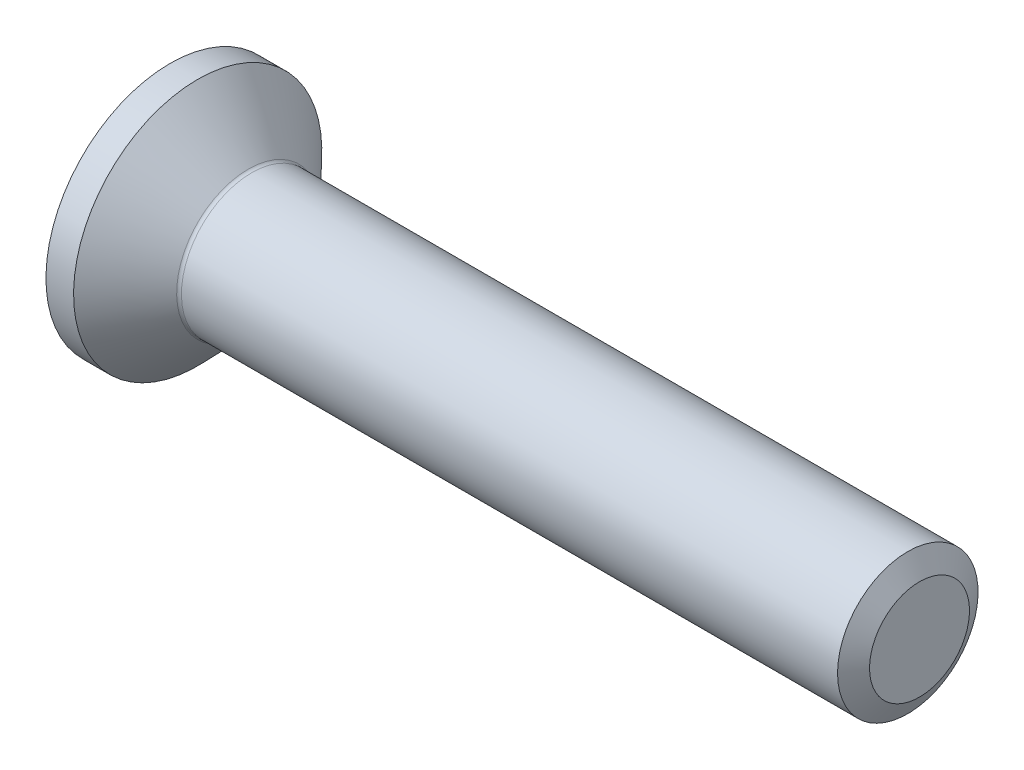
ISO-10303-21;
HEADER;
FILE_DESCRIPTION(('STEP AP214'),'2;1');
FILE_NAME('part.step','',(''),(''),'','','');
FILE_SCHEMA(('AUTOMOTIVE_DESIGN { 1 0 10303 214 1 1 1 1 }'));
ENDSEC;
DATA;
#1=APPLICATION_CONTEXT('core data for automotive mechanical design processes');
#2=APPLICATION_PROTOCOL_DEFINITION('international standard','automotive_design',2000,#1);
#3=PRODUCT_CONTEXT('',#1,'mechanical');
#4=PRODUCT('Part','Part','',(#3));
#5=PRODUCT_RELATED_PRODUCT_CATEGORY('part','',(#4));
#6=PRODUCT_DEFINITION_FORMATION('','',#4);
#7=PRODUCT_DEFINITION_CONTEXT('part definition',#1,'design');
#8=PRODUCT_DEFINITION('design','',#6,#7);
#9=PRODUCT_DEFINITION_SHAPE('','',#8);
#10=(LENGTH_UNIT() NAMED_UNIT(*) SI_UNIT(.MILLI.,.METRE.));
#11=(NAMED_UNIT(*) PLANE_ANGLE_UNIT() SI_UNIT($,.RADIAN.));
#12=(NAMED_UNIT(*) SI_UNIT($,.STERADIAN.) SOLID_ANGLE_UNIT());
#13=UNCERTAINTY_MEASURE_WITH_UNIT(LENGTH_MEASURE(1.E-05),#10,'distance_accuracy_value','');
#14=(GEOMETRIC_REPRESENTATION_CONTEXT(3) GLOBAL_UNCERTAINTY_ASSIGNED_CONTEXT((#13)) GLOBAL_UNIT_ASSIGNED_CONTEXT((#10,
#11,#12)) REPRESENTATION_CONTEXT('',''));
#15=CARTESIAN_POINT('',(0.,0.,0.));
#16=DIRECTION('',(0.,0.,1.));
#17=DIRECTION('',(1.,0.,0.));
#18=AXIS2_PLACEMENT_3D('',#15,#16,#17);
#19=CARTESIAN_POINT('',(0.,0.,0.));
#20=DIRECTION('',(1.,0.,0.));
#21=DIRECTION('',(0.,1.,0.));
#22=AXIS2_PLACEMENT_3D('',#19,#20,#21);
#23=CYLINDRICAL_SURFACE('',#22,1.5);
#24=CARTESIAN_POINT('',(-14.257552518379,0.,0.));
#25=DIRECTION('',(1.,0.,0.));
#26=DIRECTION('',(0.,1.,0.));
#27=AXIS2_PLACEMENT_3D('',#24,#25,#26);
#28=CIRCLE('',#27,1.5);
#29=CARTESIAN_POINT('',(-14.257552518379,1.5,0.));
#30=VERTEX_POINT('',#29);
#31=EDGE_CURVE('E143',#30,#30,#28,.T.);
#32=ORIENTED_EDGE('',*,*,#31,.T.);
#33=EDGE_LOOP('',(#32));
#34=FACE_BOUND('',#33,.T.);
#35=CARTESIAN_POINT('',(-0.25,0.,0.));
#36=DIRECTION('',(-1.,0.,0.));
#37=DIRECTION('',(0.,0.,1.));
#38=AXIS2_PLACEMENT_3D('',#35,#36,#37);
#39=CIRCLE('',#38,1.5);
#40=CARTESIAN_POINT('',(-0.25,0.,1.5));
#41=VERTEX_POINT('',#40);
#42=EDGE_CURVE('E333',#41,#41,#39,.T.);
#43=ORIENTED_EDGE('',*,*,#42,.T.);
#44=EDGE_LOOP('',(#43));
#45=FACE_BOUND('',#44,.T.);
#46=ADVANCED_FACE('F51',(#34,#45),#23,.T.);
#47=CARTESIAN_POINT('',(-16.,2.65,0.));
#48=DIRECTION('',(-1.,0.,0.));
#49=DIRECTION('',(0.,-1.,0.));
#50=AXIS2_PLACEMENT_3D('',#47,#48,#49);
#51=PLANE('',#50);
#52=CARTESIAN_POINT('',(-16.,0.,0.));
#53=DIRECTION('',(1.,0.,0.));
#54=DIRECTION('',(0.,1.,0.));
#55=AXIS2_PLACEMENT_3D('',#52,#53,#54);
#56=CIRCLE('',#55,2.65);
#57=CARTESIAN_POINT('',(-16.,2.65,0.));
#58=VERTEX_POINT('',#57);
#59=EDGE_CURVE('E238',#58,#58,#56,.T.);
#60=ORIENTED_EDGE('',*,*,#59,.F.);
#61=EDGE_LOOP('',(#60));
#62=FACE_BOUND('',#61,.T.);
#63=CARTESIAN_POINT('',(-16.,0.,0.));
#64=DIRECTION('',(-1.,0.,0.));
#65=DIRECTION('',(0.,-1.,0.));
#66=AXIS2_PLACEMENT_3D('',#63,#64,#65);
#67=CIRCLE('',#66,1.15470053837925);
#68=CARTESIAN_POINT('',(-16.,-0.577350269189631,0.999999999999996));
#69=VERTEX_POINT('',#68);
#70=CARTESIAN_POINT('',(-16.,-1.15470053837925,0.));
#71=VERTEX_POINT('',#70);
#72=EDGE_CURVE('E55',#69,#71,#67,.F.);
#73=ORIENTED_EDGE('',*,*,#72,.T.);
#74=CARTESIAN_POINT('',(-16.,-0.577350269189631,-0.999999999999997));
#75=VERTEX_POINT('',#74);
#76=EDGE_CURVE('E11',#71,#75,#67,.F.);
#77=ORIENTED_EDGE('',*,*,#76,.T.);
#78=CARTESIAN_POINT('',(-16.,0.577350269189626,-0.999999999999999));
#79=VERTEX_POINT('',#78);
#80=EDGE_CURVE('E61',#75,#79,#67,.F.);
#81=ORIENTED_EDGE('',*,*,#80,.T.);
#82=CARTESIAN_POINT('',(-16.,1.15470053837925,0.));
#83=VERTEX_POINT('',#82);
#84=EDGE_CURVE('E128',#79,#83,#67,.F.);
#85=ORIENTED_EDGE('',*,*,#84,.T.);
#86=CARTESIAN_POINT('',(-16.,0.,0.));
#87=DIRECTION('',(-1.,0.,0.));
#88=DIRECTION('',(0.,0.,1.));
#89=AXIS2_PLACEMENT_3D('',#86,#87,#88);
#90=CIRCLE('',#89,1.15470053837925);
#91=CARTESIAN_POINT('',(-16.,0.577350269189629,0.999999999999997));
#92=VERTEX_POINT('',#91);
#93=EDGE_CURVE('E111',#92,#83,#90,.T.);
#94=ORIENTED_EDGE('',*,*,#93,.F.);
#95=EDGE_CURVE('E121',#92,#69,#67,.F.);
#96=ORIENTED_EDGE('',*,*,#95,.T.);
#97=EDGE_LOOP('',(#73,#77,#81,#85,#94,#96));
#98=FACE_BOUND('',#97,.T.);
#99=ADVANCED_FACE('F129',(#62,#98),#51,.T.);
#100=CARTESIAN_POINT('',(0.,0.,0.));
#101=DIRECTION('',(1.,0.,0.));
#102=DIRECTION('',(0.,1.,0.));
#103=AXIS2_PLACEMENT_3D('',#100,#101,#102);
#104=CYLINDRICAL_SURFACE('',#103,2.65);
#105=ORIENTED_EDGE('',*,*,#59,.T.);
#106=EDGE_LOOP('',(#105));
#107=FACE_BOUND('',#106,.T.);
#108=CARTESIAN_POINT('',(-15.4105420910281,0.,0.));
#109=DIRECTION('',(1.,0.,0.));
#110=DIRECTION('',(0.,1.,0.));
#111=AXIS2_PLACEMENT_3D('',#108,#109,#110);
#112=CIRCLE('',#111,2.65);
#113=CARTESIAN_POINT('',(-15.4105420910281,2.65,0.));
#114=VERTEX_POINT('',#113);
#115=EDGE_CURVE('E241',#114,#114,#112,.T.);
#116=ORIENTED_EDGE('',*,*,#115,.F.);
#117=EDGE_LOOP('',(#116));
#118=FACE_BOUND('',#117,.T.);
#119=ADVANCED_FACE('F226',(#107,#118),#104,.T.);
#120=CARTESIAN_POINT('',(-14.3294864984129,0.,0.));
#121=DIRECTION('',(-1.,0.,0.));
#122=DIRECTION('',(0.,-1.,0.));
#123=AXIS2_PLACEMENT_3D('',#120,#121,#122);
#124=CONICAL_SURFACE('',#123,1.5305341629541,0.802851455917393);
#125=ORIENTED_EDGE('',*,*,#115,.T.);
#126=EDGE_LOOP('',(#125));
#127=FACE_BOUND('',#126,.T.);
#128=CARTESIAN_POINT('',(-14.3294864984129,0.,0.));
#129=DIRECTION('',(1.,0.,0.));
#130=DIRECTION('',(0.,1.,0.));
#131=AXIS2_PLACEMENT_3D('',#128,#129,#130);
#132=CIRCLE('',#131,1.5305341629541);
#133=CARTESIAN_POINT('',(-14.3294864984129,1.5305341629541,0.));
#134=VERTEX_POINT('',#133);
#135=EDGE_CURVE('E247',#134,#134,#132,.T.);
#136=ORIENTED_EDGE('',*,*,#135,.F.);
#137=EDGE_LOOP('',(#136));
#138=FACE_BOUND('',#137,.T.);
#139=ADVANCED_FACE('F222',(#127,#138),#124,.T.);
#140=CARTESIAN_POINT('',(-14.257552518379,0.,0.));
#141=DIRECTION('',(1.,0.,0.));
#142=DIRECTION('',(0.,1.,0.));
#143=AXIS2_PLACEMENT_3D('',#140,#141,#142);
#144=TOROIDAL_SURFACE('',#143,1.6,0.0999999999999996);
#145=ORIENTED_EDGE('',*,*,#135,.T.);
#146=EDGE_LOOP('',(#145));
#147=FACE_BOUND('',#146,.T.);
#148=ORIENTED_EDGE('',*,*,#31,.F.);
#149=EDGE_LOOP('',(#148));
#150=FACE_BOUND('',#149,.T.);
#151=ADVANCED_FACE('F218',(#147,#150),#144,.F.);
#152=CARTESIAN_POINT('',(-15.7,0.,0.));
#153=DIRECTION('',(-1.,0.,0.));
#154=DIRECTION('',(0.,0.,1.));
#155=AXIS2_PLACEMENT_3D('',#152,#153,#154);
#156=CONICAL_SURFACE('',#155,0.,1.31660847419538);
#157=CARTESIAN_POINT('',(-16.0000300044996,-0.57723479913579,1.0002));
#158=CARTESIAN_POINT('',(-15.9937929192042,-0.601225021738601,0.958647715567044));
#159=CARTESIAN_POINT('',(-15.9881313786167,-0.625256195021442,0.917024502475671));
#160=CARTESIAN_POINT('',(-15.9781854217223,-0.673398386330441,0.833639781140784));
#161=CARTESIAN_POINT('',(-15.9739015302713,-0.697509431260085,0.791878226299064));
#162=CARTESIAN_POINT('',(-15.9669589031667,-0.745673772514857,0.708455140132715));
#163=CARTESIAN_POINT('',(-15.9642923745456,-0.769726780462718,0.66679410829216));
#164=CARTESIAN_POINT('',(-15.9607168929941,-0.81786166422335,0.583422044002323));
#165=CARTESIAN_POINT('',(-15.9598076211353,-0.841943534003895,0.541711022001162));
#166=CARTESIAN_POINT('',(-15.9598076211353,-0.890107273564985,0.458288977998839));
#167=CARTESIAN_POINT('',(-15.9607168929941,-0.91418914334553,0.416577955997678));
#168=CARTESIAN_POINT('',(-15.9642923745456,-0.962324027106162,0.333205891707841));
#169=CARTESIAN_POINT('',(-15.9669589031667,-0.986377035054024,0.291544859867286));
#170=CARTESIAN_POINT('',(-15.9739015302713,-1.03454137630879,0.208121773700937));
#171=CARTESIAN_POINT('',(-15.9781854217223,-1.05865242123844,0.166360218859216));
#172=CARTESIAN_POINT('',(-15.9881313786167,-1.10679461254744,0.0829754975243295));
#173=CARTESIAN_POINT('',(-15.9937929192042,-1.13082578583028,0.0413522844329568));
#174=CARTESIAN_POINT('',(-16.0000300044996,-1.15481600843309,-0.000199999999999005));
#175=B_SPLINE_CURVE_WITH_KNOTS('',3,(#157,#158,#159,#160,#161,#162,#163,#164,#165,#166,#167,
#168,#169,#170,#171,#172,#173,#174),.UNSPECIFIED.,.F.,.F.,(4,2,2,2,2,2,2,2,4),(0.,
0.145159524820138,0.290374287087485,0.434883682122849,0.57936684736763,0.723850012612411,
0.868359407647776,1.01357416991512,1.15873369473526),.UNSPECIFIED.);
#176=EDGE_CURVE('E150',#69,#71,#175,.T.);
#177=ORIENTED_EDGE('',*,*,#176,.T.);
#178=ORIENTED_EDGE('',*,*,#72,.F.);
#179=EDGE_LOOP('',(#177,#178));
#180=FACE_BOUND('',#179,.T.);
#181=ADVANCED_FACE('F221',(#180),#156,.F.);
#182=CARTESIAN_POINT('',(-16.1701338061757,-1.50813004503231,1.));
#183=CARTESIAN_POINT('',(-16.1603550434582,-1.4629616955144,1.));
#184=CARTESIAN_POINT('',(-16.1507010634319,-1.41776633015548,1.));
#185=CARTESIAN_POINT('',(-16.1317057249496,-1.32730802004726,1.));
#186=CARTESIAN_POINT('',(-16.1223643798043,-1.28204507250605,1.));
#187=CARTESIAN_POINT('',(-16.094887707109,-1.14605409321351,1.));
#188=CARTESIAN_POINT('',(-16.077318593487,-1.05520983554784,1.));
#189=CARTESIAN_POINT('',(-16.0446113120355,-0.873838301527075,1.));
#190=CARTESIAN_POINT('',(-16.0294545669183,-0.783314439111175,1.));
#191=CARTESIAN_POINT('',(-16.0026000869216,-0.601754544937862,1.));
#192=CARTESIAN_POINT('',(-15.9909016960468,-0.510718613654574,1.));
#193=CARTESIAN_POINT('',(-15.9724688104588,-0.327147289363391,1.));
#194=CARTESIAN_POINT('',(-15.965787761882,-0.234606191530869,1.));
#195=CARTESIAN_POINT('',(-15.9590368362792,-0.049304654603892,1.));
#196=CARTESIAN_POINT('',(-15.9589640024594,0.0434556678202334,1.));
#197=CARTESIAN_POINT('',(-15.9654534933963,0.229083736297408,1.));
#198=CARTESIAN_POINT('',(-15.9720414736928,0.321950510989412,1.));
#199=CARTESIAN_POINT('',(-15.9904572139866,0.507192547661323,1.));
#200=CARTESIAN_POINT('',(-16.0022884816114,0.599567438647768,1.));
#201=CARTESIAN_POINT('',(-16.0298118313046,0.785811374344477,1.));
#202=CARTESIAN_POINT('',(-16.0455836030667,0.879668210998828,1.));
#203=CARTESIAN_POINT('',(-16.0795232966728,1.06695285350417,1.));
#204=CARTESIAN_POINT('',(-16.0976915787193,1.16038059267178,1.));
#205=CARTESIAN_POINT('',(-16.1355853163011,1.34694314919725,1.));
#206=CARTESIAN_POINT('',(-16.1553112029702,1.44007787798179,1.));
#207=CARTESIAN_POINT('',(-16.1957971322914,1.62612272763755,1.));
#208=CARTESIAN_POINT('',(-16.216557196056,1.71903284388273,1.));
#209=CARTESIAN_POINT('',(-16.2585485742601,1.90363742744431,1.));
#210=CARTESIAN_POINT('',(-16.2797718689088,1.99533372655925,1.));
#211=CARTESIAN_POINT('',(-16.3227143057913,2.17861191601367,1.));
#212=CARTESIAN_POINT('',(-16.3444334585808,2.27019380387373,1.));
#213=CARTESIAN_POINT('',(-16.3882042420233,2.45314970796374,1.));
#214=CARTESIAN_POINT('',(-16.4102553943374,2.54452383886909,1.));
#215=CARTESIAN_POINT('',(-16.4546332471854,2.72720190599484,1.));
#216=CARTESIAN_POINT('',(-16.4769599382911,2.81850584450411,1.));
#217=CARTESIAN_POINT('',(-16.4993826695211,2.90978592143881,1.));
#218=B_SPLINE_CURVE_WITH_KNOTS('',3,(#182,#183,#184,#185,#186,#187,#188,#189,#190,#191,#192,
#193,#194,#195,#196,#197,#198,#199,#200,#201,#202,#203,#204,#205,#206,#207,#208,#209,#210,#211,
#212,#213,#214,#215,#216,#217),.UNSPECIFIED.,.F.,.F.,(4,2,2,2,2,2,2,2,2,2,2,2,2,2,2,2,2,4),(0.,
0.138643869889784,0.277293635233155,0.554857004517547,0.830167022781712,1.10542478551795,
1.38357462934899,1.66160001660697,1.94070037269333,2.21998772241581,2.50545939030147,
2.79097401441241,3.07656794584653,3.36216771000263,3.64452690710854,3.92689212062336,
4.2088834354874,4.49086512790399),.UNSPECIFIED.);
#219=EDGE_CURVE('E117',#92,#69,#218,.F.);
#220=ORIENTED_EDGE('',*,*,#219,.T.);
#221=ORIENTED_EDGE('',*,*,#95,.F.);
#222=EDGE_LOOP('',(#220,#221));
#223=FACE_BOUND('',#222,.T.);
#224=ADVANCED_FACE('F122',(#223),#156,.F.);
#225=CARTESIAN_POINT('',(-16.0000300044996,1.15481600843309,-0.000199999999999895));
#226=CARTESIAN_POINT('',(-15.9937929192042,1.13082578583028,0.0413522844329561));
#227=CARTESIAN_POINT('',(-15.9881313786167,1.10679461254744,0.0829754975243288));
#228=CARTESIAN_POINT('',(-15.9781854217223,1.05865242123844,0.166360218859215));
#229=CARTESIAN_POINT('',(-15.9739015302713,1.03454137630879,0.208121773700936));
#230=CARTESIAN_POINT('',(-15.9669589031667,0.986377035054022,0.291544859867285));
#231=CARTESIAN_POINT('',(-15.9642923745456,0.96232402710616,0.33320589170784));
#232=CARTESIAN_POINT('',(-15.9607168929941,0.914189143345528,0.416577955997677));
#233=CARTESIAN_POINT('',(-15.9598076211353,0.890107273564984,0.458288977998838));
#234=CARTESIAN_POINT('',(-15.9598076211353,0.841943534003894,0.541711022001161));
#235=CARTESIAN_POINT('',(-15.9607168929941,0.817861664223349,0.583422044002322));
#236=CARTESIAN_POINT('',(-15.9642923745456,0.769726780462717,0.666794108292159));
#237=CARTESIAN_POINT('',(-15.9669589031667,0.745673772514855,0.708455140132714));
#238=CARTESIAN_POINT('',(-15.9739015302713,0.697509431260084,0.791878226299063));
#239=CARTESIAN_POINT('',(-15.9781854217223,0.673398386330439,0.833639781140784));
#240=CARTESIAN_POINT('',(-15.9881313786167,0.62525619502144,0.917024502475671));
#241=CARTESIAN_POINT('',(-15.9937929192042,0.601225021738599,0.958647715567043));
#242=CARTESIAN_POINT('',(-16.0000300044996,0.577234799135788,1.0002));
#243=B_SPLINE_CURVE_WITH_KNOTS('',3,(#225,#226,#227,#228,#229,#230,#231,#232,#233,#234,#235,
#236,#237,#238,#239,#240,#241,#242),.UNSPECIFIED.,.F.,.F.,(4,2,2,2,2,2,2,2,4),(0.,
0.145159524820137,0.290374287087485,0.434883682122849,0.57936684736763,0.723850012612411,
0.868359407647776,1.01357416991512,1.15873369473526),.UNSPECIFIED.);
#244=EDGE_CURVE('E107',#83,#92,#243,.T.);
#245=ORIENTED_EDGE('',*,*,#244,.T.);
#246=ORIENTED_EDGE('',*,*,#93,.T.);
#247=EDGE_LOOP('',(#245,#246));
#248=FACE_BOUND('',#247,.T.);
#249=ADVANCED_FACE('F109',(#248),#156,.F.);
#250=CARTESIAN_POINT('',(-16.0000300044996,0.577234799135788,-1.0002));
#251=CARTESIAN_POINT('',(-15.9937929192042,0.601225021738599,-0.958647715567043));
#252=CARTESIAN_POINT('',(-15.9881313786167,0.62525619502144,-0.91702450247567));
#253=CARTESIAN_POINT('',(-15.9781854217223,0.673398386330439,-0.833639781140784));
#254=CARTESIAN_POINT('',(-15.9739015302713,0.697509431260083,-0.791878226299063));
#255=CARTESIAN_POINT('',(-15.9669589031667,0.745673772514855,-0.708455140132714));
#256=CARTESIAN_POINT('',(-15.9642923745456,0.769726780462716,-0.666794108292159));
#257=CARTESIAN_POINT('',(-15.9607168929941,0.817861664223348,-0.583422044002322));
#258=CARTESIAN_POINT('',(-15.9598076211353,0.841943534003893,-0.541711022001161));
#259=CARTESIAN_POINT('',(-15.9598076211353,0.890107273564983,-0.458288977998838));
#260=CARTESIAN_POINT('',(-15.9607168929941,0.914189143345528,-0.416577955997677));
#261=CARTESIAN_POINT('',(-15.9642923745456,0.96232402710616,-0.33320589170784));
#262=CARTESIAN_POINT('',(-15.9669589031667,0.986377035054022,-0.291544859867286));
#263=CARTESIAN_POINT('',(-15.9739015302713,1.03454137630879,-0.208121773700936));
#264=CARTESIAN_POINT('',(-15.9781854217223,1.05865242123844,-0.166360218859216));
#265=CARTESIAN_POINT('',(-15.9881313786167,1.10679461254744,-0.082975497524329));
#266=CARTESIAN_POINT('',(-15.9937929192042,1.13082578583028,-0.0413522844329563));
#267=CARTESIAN_POINT('',(-16.0000300044996,1.15481600843309,0.000199999999999538));
#268=B_SPLINE_CURVE_WITH_KNOTS('',3,(#250,#251,#252,#253,#254,#255,#256,#257,#258,#259,#260,
#261,#262,#263,#264,#265,#266,#267),.UNSPECIFIED.,.F.,.F.,(4,2,2,2,2,2,2,2,4),(0.,
0.145159524820137,0.290374287087484,0.434883682122849,0.57936684736763,0.723850012612411,
0.868359407647776,1.01357416991512,1.15873369473526),.UNSPECIFIED.);
#269=EDGE_CURVE('E132',#79,#83,#268,.T.);
#270=ORIENTED_EDGE('',*,*,#269,.T.);
#271=ORIENTED_EDGE('',*,*,#84,.F.);
#272=EDGE_LOOP('',(#270,#271));
#273=FACE_BOUND('',#272,.T.);
#274=ADVANCED_FACE('F407',(#273),#156,.F.);
#275=CARTESIAN_POINT('',(-16.1701338061757,-1.50813004503231,-0.999999999999999));
#276=CARTESIAN_POINT('',(-16.1603550434582,-1.4629616955144,-0.999999999999999));
#277=CARTESIAN_POINT('',(-16.1507010634319,-1.41776633015548,-0.999999999999999));
#278=CARTESIAN_POINT('',(-16.1317057249496,-1.32730802004726,-0.999999999999999));
#279=CARTESIAN_POINT('',(-16.1223643798043,-1.28204507250605,-0.999999999999999));
#280=CARTESIAN_POINT('',(-16.094887707109,-1.14605409321351,-0.999999999999999));
#281=CARTESIAN_POINT('',(-16.077318593487,-1.05520983554784,-0.999999999999999));
#282=CARTESIAN_POINT('',(-16.0446113120355,-0.873838301527075,-0.999999999999999));
#283=CARTESIAN_POINT('',(-16.0294545669183,-0.783314439111175,-0.999999999999999));
#284=CARTESIAN_POINT('',(-16.0026000869216,-0.601754544937862,-0.999999999999999));
#285=CARTESIAN_POINT('',(-15.9909016960468,-0.510718613654574,-0.999999999999999));
#286=CARTESIAN_POINT('',(-15.9724688104588,-0.327147289363391,-0.999999999999999));
#287=CARTESIAN_POINT('',(-15.965787761882,-0.23460619153087,-0.999999999999999));
#288=CARTESIAN_POINT('',(-15.9590368362792,-0.0493046546038928,-0.999999999999999));
#289=CARTESIAN_POINT('',(-15.9589640024594,0.0434556678202325,-0.999999999999999));
#290=CARTESIAN_POINT('',(-15.9654534933963,0.229083736297407,-0.999999999999999));
#291=CARTESIAN_POINT('',(-15.9720414736928,0.321950510989411,-0.999999999999999));
#292=CARTESIAN_POINT('',(-15.9904572139866,0.507192547661323,-0.999999999999999));
#293=CARTESIAN_POINT('',(-16.0022884816114,0.599567438647768,-0.999999999999999));
#294=CARTESIAN_POINT('',(-16.0298118313046,0.785811374344477,-0.999999999999999));
#295=CARTESIAN_POINT('',(-16.0455836030667,0.879668210998828,-0.999999999999999));
#296=CARTESIAN_POINT('',(-16.0795232966728,1.06695285350417,-0.999999999999999));
#297=CARTESIAN_POINT('',(-16.0976915787193,1.16038059267178,-0.999999999999999));
#298=CARTESIAN_POINT('',(-16.1355853163011,1.34694314919726,-0.999999999999999));
#299=CARTESIAN_POINT('',(-16.1553112029702,1.44007787798179,-0.999999999999999));
#300=CARTESIAN_POINT('',(-16.1957971322914,1.62612272763755,-0.999999999999999));
#301=CARTESIAN_POINT('',(-16.216557196056,1.71903284388273,-0.999999999999999));
#302=CARTESIAN_POINT('',(-16.2585485742601,1.90363742744432,-0.999999999999999));
#303=CARTESIAN_POINT('',(-16.2797718689088,1.99533372655926,-0.999999999999999));
#304=CARTESIAN_POINT('',(-16.3227143057913,2.17861191601367,-0.999999999999999));
#305=CARTESIAN_POINT('',(-16.3444334585808,2.27019380387373,-0.999999999999999));
#306=CARTESIAN_POINT('',(-16.3882042420233,2.45314970796374,-0.999999999999999));
#307=CARTESIAN_POINT('',(-16.4102553943374,2.54452383886909,-0.999999999999999));
#308=CARTESIAN_POINT('',(-16.4546332471854,2.72720190599484,-0.999999999999999));
#309=CARTESIAN_POINT('',(-16.4769599382911,2.81850584450411,-0.999999999999999));
#310=CARTESIAN_POINT('',(-16.4993826695211,2.90978592143881,-0.999999999999999));
#311=B_SPLINE_CURVE_WITH_KNOTS('',3,(#275,#276,#277,#278,#279,#280,#281,#282,#283,#284,#285,
#286,#287,#288,#289,#290,#291,#292,#293,#294,#295,#296,#297,#298,#299,#300,#301,#302,#303,#304,
#305,#306,#307,#308,#309,#310),.UNSPECIFIED.,.F.,.F.,(4,2,2,2,2,2,2,2,2,2,2,2,2,2,2,2,2,4),(0.,
0.138643869889783,0.277293635233155,0.554857004517547,0.830167022781712,1.10542478551795,
1.38357462934899,1.66160001660697,1.94070037269333,2.21998772241581,2.50545939030147,
2.79097401441241,3.07656794584654,3.36216771000263,3.64452690710854,3.92689212062336,
4.2088834354874,4.49086512790399),.UNSPECIFIED.);
#312=EDGE_CURVE('E299',#75,#79,#311,.T.);
#313=ORIENTED_EDGE('',*,*,#312,.T.);
#314=ORIENTED_EDGE('',*,*,#80,.F.);
#315=EDGE_LOOP('',(#313,#314));
#316=FACE_BOUND('',#315,.T.);
#317=ADVANCED_FACE('F321',(#316),#156,.F.);
#318=CARTESIAN_POINT('',(-16.0000300044996,-1.15481600843309,0.000200000000000662));
#319=CARTESIAN_POINT('',(-15.9937929192042,-1.13082578583028,-0.0413522844329552));
#320=CARTESIAN_POINT('',(-15.9881313786167,-1.10679461254744,-0.0829754975243279));
#321=CARTESIAN_POINT('',(-15.9781854217223,-1.05865242123844,-0.166360218859215));
#322=CARTESIAN_POINT('',(-15.9739015302713,-1.0345413763088,-0.208121773700935));
#323=CARTESIAN_POINT('',(-15.9669589031667,-0.986377035054024,-0.291544859867285));
#324=CARTESIAN_POINT('',(-15.9642923745456,-0.962324027106162,-0.333205891707839));
#325=CARTESIAN_POINT('',(-15.9607168929941,-0.91418914334553,-0.416577955997676));
#326=CARTESIAN_POINT('',(-15.9598076211353,-0.890107273564986,-0.458288977998838));
#327=CARTESIAN_POINT('',(-15.9598076211353,-0.841943534003896,-0.54171102200116));
#328=CARTESIAN_POINT('',(-15.9607168929941,-0.817861664223351,-0.583422044002322));
#329=CARTESIAN_POINT('',(-15.9642923745456,-0.769726780462719,-0.666794108292158));
#330=CARTESIAN_POINT('',(-15.9669589031667,-0.745673772514857,-0.708455140132713));
#331=CARTESIAN_POINT('',(-15.9739015302713,-0.697509431260086,-0.791878226299063));
#332=CARTESIAN_POINT('',(-15.9781854217223,-0.673398386330441,-0.833639781140783));
#333=CARTESIAN_POINT('',(-15.9881313786167,-0.625256195021443,-0.91702450247567));
#334=CARTESIAN_POINT('',(-15.9937929192042,-0.601225021738601,-0.958647715567043));
#335=CARTESIAN_POINT('',(-16.0000300044996,-0.57723479913579,-1.0002));
#336=B_SPLINE_CURVE_WITH_KNOTS('',3,(#318,#319,#320,#321,#322,#323,#324,#325,#326,#327,#328,
#329,#330,#331,#332,#333,#334,#335),.UNSPECIFIED.,.F.,.F.,(4,2,2,2,2,2,2,2,4),(0.,
0.145159524820137,0.290374287087484,0.434883682122849,0.57936684736763,0.723850012612411,
0.868359407647776,1.01357416991512,1.15873369473526),.UNSPECIFIED.);
#337=EDGE_CURVE('E153',#71,#75,#336,.T.);
#338=ORIENTED_EDGE('',*,*,#337,.T.);
#339=ORIENTED_EDGE('',*,*,#76,.F.);
#340=EDGE_LOOP('',(#338,#339));
#341=FACE_BOUND('',#340,.T.);
#342=ADVANCED_FACE('F317',(#341),#156,.F.);
#343=CARTESIAN_POINT('',(-14.9,0.,0.));
#344=DIRECTION('',(-1.,0.,0.));
#345=DIRECTION('',(0.,0.,1.));
#346=AXIS2_PLACEMENT_3D('',#343,#344,#345);
#347=CONICAL_SURFACE('',#346,1.15470053837925,1.0471975511966);
#348=CARTESIAN_POINT('',(-14.2333333333333,0.,0.));
#349=VERTEX_POINT('',#348);
#350=VERTEX_LOOP('',#349);
#351=FACE_BOUND('',#350,.T.);
#352=CARTESIAN_POINT('',(-15.2718352887395,-1.49514512143374,1.));
#353=CARTESIAN_POINT('',(-15.2511150207934,-1.4519612611533,1.));
#354=CARTESIAN_POINT('',(-15.2306136723495,-1.40867282404236,1.));
#355=CARTESIAN_POINT('',(-15.1901634335246,-1.32182947914248,1.));
#356=CARTESIAN_POINT('',(-15.1702146425673,-1.27827452509756,1.));
#357=CARTESIAN_POINT('',(-15.1111451548365,-1.14662339890625,1.));
#358=CARTESIAN_POINT('',(-15.073052526533,-1.05805724149109,1.));
#359=CARTESIAN_POINT('',(-15.0002458207006,-0.876833003172499,1.));
#360=CARTESIAN_POINT('',(-14.9656458404539,-0.784128452056497,1.));
#361=CARTESIAN_POINT('',(-14.9040734738185,-0.596331746532132,1.));
#362=CARTESIAN_POINT('',(-14.8770812848479,-0.501246505541257,1.));
#363=CARTESIAN_POINT('',(-14.845775770035,-0.356699986452704,1.));
#364=CARTESIAN_POINT('',(-14.836875098547,-0.30824416317171,1.));
#365=CARTESIAN_POINT('',(-14.8227424317569,-0.210788870695444,1.));
#366=CARTESIAN_POINT('',(-14.8175101885352,-0.161789438465743,1.));
#367=CARTESIAN_POINT('',(-14.8111989809818,-0.0641060489970667,1.));
#368=CARTESIAN_POINT('',(-14.8100710050111,-0.0154253461269776,1.));
#369=CARTESIAN_POINT('',(-14.8119329783051,0.0818553564032749,1.));
#370=CARTESIAN_POINT('',(-14.8149231825536,0.130455350879702,1.));
#371=CARTESIAN_POINT('',(-14.8271183217293,0.250369589613778,1.));
#372=CARTESIAN_POINT('',(-14.8386085609849,0.321451919115027,1.));
#373=CARTESIAN_POINT('',(-14.8682403173976,0.462229038490167,1.));
#374=CARTESIAN_POINT('',(-14.8863898509449,0.531922048861732,1.));
#375=CARTESIAN_POINT('',(-14.9278697226866,0.671415729806805,1.));
#376=CARTESIAN_POINT('',(-14.9513071683069,0.74118372941807,1.));
#377=CARTESIAN_POINT('',(-15.0015644882464,0.879438319396288,1.));
#378=CARTESIAN_POINT('',(-15.0283831752305,0.94792534993256,1.));
#379=CARTESIAN_POINT('',(-15.1000539154734,1.12214515906645,1.));
#380=CARTESIAN_POINT('',(-15.146572305199,1.22718574040678,1.));
#381=CARTESIAN_POINT('',(-15.242876922248,1.43575968104558,1.));
#382=CARTESIAN_POINT('',(-15.2926639878222,1.53929264533347,1.));
#383=CARTESIAN_POINT('',(-15.3943364445346,1.74546702338822,1.));
#384=CARTESIAN_POINT('',(-15.446224181867,1.84810727553999,1.));
#385=CARTESIAN_POINT('',(-15.5513383688352,2.05270058021726,1.));
#386=CARTESIAN_POINT('',(-15.6045648626723,2.15465360991173,1.));
#387=CARTESIAN_POINT('',(-15.7068669169112,2.34846553091283,1.));
#388=CARTESIAN_POINT('',(-15.755859658964,2.44036823161571,1.));
#389=CARTESIAN_POINT('',(-15.8544031328282,2.623877990053,1.));
#390=CARTESIAN_POINT('',(-15.9039538852895,2.71548503668387,1.));
#391=CARTESIAN_POINT('',(-16.0033471076798,2.89823865557593,1.));
#392=CARTESIAN_POINT('',(-16.053188515041,2.98938580641155,1.));
#393=CARTESIAN_POINT('',(-16.1531957233761,3.17149583112622,1.));
#394=CARTESIAN_POINT('',(-16.2033615072371,3.26245871439935,1.));
#395=CARTESIAN_POINT('',(-16.253646212205,3.35335539208176,1.));
#396=B_SPLINE_CURVE_WITH_KNOTS('',3,(#352,#353,#354,#355,#356,#357,#358,#359,#360,#361,#362,
#363,#364,#365,#366,#367,#368,#369,#370,#371,#372,#373,#374,#375,#376,#377,#378,#379,#380,#381,
#382,#383,#384,#385,#386,#387,#388,#389,#390,#391,#392,#393,#394,#395),.UNSPECIFIED.,.F.,.F.,(4,
2,2,2,2,2,2,2,2,2,2,2,2,2,2,2,2,2,2,2,2,4),(0.,0.143690341820649,0.287406372566271,
0.576560332877489,0.873259488934029,1.16917907000006,1.31686338831957,1.46453772487642,
1.61044269221659,1.75635669390452,1.97192533331898,2.18775432802313,2.40842600301165,
2.62902040304935,2.97355048126458,3.31816926186283,3.66318417395131,4.00821049225242,
4.32064609598596,4.63309330006988,4.94474578248761,5.25638195528641),.UNSPECIFIED.);
#397=CARTESIAN_POINT('',(-14.9,-0.577350269189627,1.));
#398=VERTEX_POINT('',#397);
#399=CARTESIAN_POINT('',(-14.9,0.577350269189626,1.));
#400=VERTEX_POINT('',#399);
#401=EDGE_CURVE('E185',#398,#400,#396,.T.);
#402=ORIENTED_EDGE('',*,*,#401,.T.);
#403=CARTESIAN_POINT('',(-14.9000666766657,0.577234799135788,1.0002));
#404=CARTESIAN_POINT('',(-14.8854089736491,0.602607795820547,0.95625268060172));
#405=CARTESIAN_POINT('',(-14.8720777236209,0.628199807531657,0.91192601605018));
#406=CARTESIAN_POINT('',(-14.8488065076235,0.679827098330831,0.822504925328878));
#407=CARTESIAN_POINT('',(-14.8388747765498,0.705863295614158,0.777408908798269));
#408=CARTESIAN_POINT('',(-14.8234126948821,0.757612978088367,0.687775829477381));
#409=CARTESIAN_POINT('',(-14.817779468099,0.783318495222183,0.643252567766781));
#410=CARTESIAN_POINT('',(-14.8110512886403,0.834850648373671,0.553996260284983));
#411=CARTESIAN_POINT('',(-14.8099507679217,0.860677096749781,0.509263539518506));
#412=CARTESIAN_POINT('',(-14.8122250522981,0.908946264126689,0.425658889182654));
#413=CARTESIAN_POINT('',(-14.8150414388634,0.931396163287557,0.386774523211234));
#414=CARTESIAN_POINT('',(-14.8239724502174,0.976149681982093,0.309259155014814));
#415=CARTESIAN_POINT('',(-14.8300901337543,0.998453146411451,0.270628421438361));
#416=CARTESIAN_POINT('',(-14.8453857257258,1.04329913914046,0.192952883515855));
#417=CARTESIAN_POINT('',(-14.854628552169,1.0658359836813,0.153917923728832));
#418=CARTESIAN_POINT('',(-14.8756068457555,1.11057330008463,0.0764306187239878));
#419=CARTESIAN_POINT('',(-14.8873373751337,1.13277434629517,0.0379772787061406));
#420=CARTESIAN_POINT('',(-14.9000666766657,1.15481600843309,-0.000200000000000024));
#421=B_SPLINE_CURVE_WITH_KNOTS('',3,(#403,#404,#405,#406,#407,#408,#409,#410,#411,#412,#413,
#414,#415,#416,#417,#418,#419,#420),.UNSPECIFIED.,.F.,.F.,(4,2,2,2,2,2,2,2,4),(0.,
0.158523820030115,0.317428970089342,0.472400167924633,0.627180939971647,0.76201658487271,
0.896977373984232,1.03493410168667,1.17261952416172),.UNSPECIFIED.);
#422=CARTESIAN_POINT('',(-14.9,1.15470053837925,0.));
#423=VERTEX_POINT('',#422);
#424=EDGE_CURVE('E139',#400,#423,#421,.T.);
#425=ORIENTED_EDGE('',*,*,#424,.T.);
#426=CARTESIAN_POINT('',(-14.9000666766657,1.15481600843309,0.000200000000000105));
#427=CARTESIAN_POINT('',(-14.8854089736491,1.12944301174833,-0.0437473193982796));
#428=CARTESIAN_POINT('',(-14.8720777236209,1.10385100003722,-0.0880739839498198));
#429=CARTESIAN_POINT('',(-14.8488065076235,1.05222370923805,-0.177495074671121));
#430=CARTESIAN_POINT('',(-14.8388747765498,1.02618751195472,-0.222591091201731));
#431=CARTESIAN_POINT('',(-14.8234126948821,0.97443782948051,-0.312224170522618));
#432=CARTESIAN_POINT('',(-14.817779468099,0.948732312346694,-0.356747432233219));
#433=CARTESIAN_POINT('',(-14.8110512886403,0.897200159195206,-0.446003739715017));
#434=CARTESIAN_POINT('',(-14.8099507679217,0.871373710819096,-0.490736460481494));
#435=CARTESIAN_POINT('',(-14.8122250522981,0.823104543442188,-0.574341110817346));
#436=CARTESIAN_POINT('',(-14.8150414388634,0.800654644281321,-0.613225476788766));
#437=CARTESIAN_POINT('',(-14.8239724502174,0.755901125586785,-0.690740844985186));
#438=CARTESIAN_POINT('',(-14.8300901337543,0.733597661157427,-0.729371578561638));
#439=CARTESIAN_POINT('',(-14.8453857257258,0.688751668428419,-0.807047116484144));
#440=CARTESIAN_POINT('',(-14.854628552169,0.666214823887575,-0.846082076271167));
#441=CARTESIAN_POINT('',(-14.8756068457555,0.62147750748425,-0.923569381276011));
#442=CARTESIAN_POINT('',(-14.8873373751337,0.599276461273706,-0.962022721293858));
#443=CARTESIAN_POINT('',(-14.9000666766657,0.577234799135788,-1.0002));
#444=B_SPLINE_CURVE_WITH_KNOTS('',3,(#426,#427,#428,#429,#430,#431,#432,#433,#434,#435,#436,
#437,#438,#439,#440,#441,#442,#443),.UNSPECIFIED.,.F.,.F.,(4,2,2,2,2,2,2,2,4),(0.,
0.158523820030115,0.317428970089342,0.472400167924633,0.627180939971647,0.76201658487271,
0.896977373984232,1.03493410168667,1.17261952416172),.UNSPECIFIED.);
#445=CARTESIAN_POINT('',(-14.9,0.577350269189626,-1.));
#446=VERTEX_POINT('',#445);
#447=EDGE_CURVE('E240',#423,#446,#444,.T.);
#448=ORIENTED_EDGE('',*,*,#447,.T.);
#449=CARTESIAN_POINT('',(-15.2718352887395,-1.49514512143374,-0.999999999999999));
#450=CARTESIAN_POINT('',(-15.2511150207934,-1.4519612611533,-0.999999999999999));
#451=CARTESIAN_POINT('',(-15.2306136723495,-1.40867282404236,-0.999999999999999));
#452=CARTESIAN_POINT('',(-15.1901634335246,-1.32182947914248,-0.999999999999999));
#453=CARTESIAN_POINT('',(-15.1702146425673,-1.27827452509756,-0.999999999999999));
#454=CARTESIAN_POINT('',(-15.1111451548365,-1.14662339890625,-0.999999999999999));
#455=CARTESIAN_POINT('',(-15.073052526533,-1.05805724149109,-0.999999999999999));
#456=CARTESIAN_POINT('',(-15.0002458207006,-0.876833003172498,-0.999999999999999));
#457=CARTESIAN_POINT('',(-14.9656458404539,-0.784128452056496,-0.999999999999999));
#458=CARTESIAN_POINT('',(-14.9040734738185,-0.596331746532132,-0.999999999999999));
#459=CARTESIAN_POINT('',(-14.8770812848479,-0.501246505541257,-0.999999999999999));
#460=CARTESIAN_POINT('',(-14.845775770035,-0.356699986452704,-0.999999999999999));
#461=CARTESIAN_POINT('',(-14.836875098547,-0.30824416317171,-0.999999999999999));
#462=CARTESIAN_POINT('',(-14.8227424317569,-0.210788870695444,-0.999999999999999));
#463=CARTESIAN_POINT('',(-14.8175101885352,-0.161789438465743,-0.999999999999999));
#464=CARTESIAN_POINT('',(-14.8111989809818,-0.0641060489970673,-0.999999999999999));
#465=CARTESIAN_POINT('',(-14.8100710050111,-0.0154253461269783,-0.999999999999999));
#466=CARTESIAN_POINT('',(-14.8119329783051,0.081855356403274,-0.999999999999999));
#467=CARTESIAN_POINT('',(-14.8149231825536,0.130455350879701,-0.999999999999999));
#468=CARTESIAN_POINT('',(-14.8271183217293,0.250369589613776,-0.999999999999999));
#469=CARTESIAN_POINT('',(-14.8386085609849,0.321451919115025,-0.999999999999999));
#470=CARTESIAN_POINT('',(-14.8682403173976,0.462229038490166,-0.999999999999999));
#471=CARTESIAN_POINT('',(-14.8863898509449,0.531922048861731,-0.999999999999999));
#472=CARTESIAN_POINT('',(-14.9278697226866,0.671415729806803,-0.999999999999999));
#473=CARTESIAN_POINT('',(-14.9513071683069,0.741183729418068,-0.999999999999999));
#474=CARTESIAN_POINT('',(-15.0015644882464,0.879438319396286,-0.999999999999999));
#475=CARTESIAN_POINT('',(-15.0283831752305,0.947925349932558,-0.999999999999999));
#476=CARTESIAN_POINT('',(-15.1000539154734,1.12214515906644,-0.999999999999999));
#477=CARTESIAN_POINT('',(-15.146572305199,1.22718574040677,-0.999999999999999));
#478=CARTESIAN_POINT('',(-15.242876922248,1.43575968104558,-0.999999999999999));
#479=CARTESIAN_POINT('',(-15.2926639878222,1.53929264533347,-0.999999999999999));
#480=CARTESIAN_POINT('',(-15.3943364445346,1.74546702338821,-0.999999999999999));
#481=CARTESIAN_POINT('',(-15.446224181867,1.84810727553998,-0.999999999999999));
#482=CARTESIAN_POINT('',(-15.5513383688352,2.05270058021726,-0.999999999999999));
#483=CARTESIAN_POINT('',(-15.6045648626723,2.15465360991172,-0.999999999999999));
#484=CARTESIAN_POINT('',(-15.7068669169112,2.34846553091283,-0.999999999999999));
#485=CARTESIAN_POINT('',(-15.755859658964,2.44036823161571,-0.999999999999999));
#486=CARTESIAN_POINT('',(-15.8544031328282,2.623877990053,-0.999999999999999));
#487=CARTESIAN_POINT('',(-15.9039538852895,2.71548503668387,-0.999999999999999));
#488=CARTESIAN_POINT('',(-16.0033471076798,2.89823865557593,-0.999999999999999));
#489=CARTESIAN_POINT('',(-16.053188515041,2.98938580641155,-0.999999999999999));
#490=CARTESIAN_POINT('',(-16.1531957233761,3.17149583112622,-0.999999999999999));
#491=CARTESIAN_POINT('',(-16.2033615072371,3.26245871439935,-0.999999999999999));
#492=CARTESIAN_POINT('',(-16.253646212205,3.35335539208175,-0.999999999999999));
#493=B_SPLINE_CURVE_WITH_KNOTS('',3,(#449,#450,#451,#452,#453,#454,#455,#456,#457,#458,#459,
#460,#461,#462,#463,#464,#465,#466,#467,#468,#469,#470,#471,#472,#473,#474,#475,#476,#477,#478,
#479,#480,#481,#482,#483,#484,#485,#486,#487,#488,#489,#490,#491,#492),.UNSPECIFIED.,.F.,.F.,(4,
2,2,2,2,2,2,2,2,2,2,2,2,2,2,2,2,2,2,2,2,4),(0.,0.14369034182065,0.287406372566273,
0.576560332877492,0.873259488934031,1.16917907000006,1.31686338831957,1.46453772487642,
1.61044269221659,1.75635669390452,1.97192533331898,2.18775432802313,2.40842600301165,
2.62902040304935,2.97355048126458,3.31816926186283,3.6631841739513,4.00821049225242,
4.32064609598596,4.63309330006988,4.94474578248761,5.25638195528641),.UNSPECIFIED.);
#494=CARTESIAN_POINT('',(-14.9,-0.577350269189628,-0.999999999999999));
#495=VERTEX_POINT('',#494);
#496=EDGE_CURVE('E116',#446,#495,#493,.F.);
#497=ORIENTED_EDGE('',*,*,#496,.T.);
#498=CARTESIAN_POINT('',(-14.9000666766657,-0.57723479913579,-1.0002));
#499=CARTESIAN_POINT('',(-14.8854089736491,-0.602607795820549,-0.956252680601719));
#500=CARTESIAN_POINT('',(-14.8720777236209,-0.628199807531659,-0.911926016050179));
#501=CARTESIAN_POINT('',(-14.8488065076235,-0.679827098330833,-0.822504925328877));
#502=CARTESIAN_POINT('',(-14.8388747765498,-0.70586329561416,-0.777408908798268));
#503=CARTESIAN_POINT('',(-14.8234126948821,-0.757612978088369,-0.68777582947738));
#504=CARTESIAN_POINT('',(-14.817779468099,-0.783318495222185,-0.643252567766779));
#505=CARTESIAN_POINT('',(-14.8110512886403,-0.834850648373673,-0.553996260284981));
#506=CARTESIAN_POINT('',(-14.8099507679217,-0.860677096749783,-0.509263539518504));
#507=CARTESIAN_POINT('',(-14.8122250522981,-0.908946264126692,-0.425658889182652));
#508=CARTESIAN_POINT('',(-14.8150414388634,-0.931396163287559,-0.386774523211232));
#509=CARTESIAN_POINT('',(-14.8239724502174,-0.976149681982095,-0.309259155014812));
#510=CARTESIAN_POINT('',(-14.8300901337543,-0.998453146411452,-0.270628421438359));
#511=CARTESIAN_POINT('',(-14.8453857257258,-1.04329913914046,-0.192952883515853));
#512=CARTESIAN_POINT('',(-14.854628552169,-1.0658359836813,-0.153917923728831));
#513=CARTESIAN_POINT('',(-14.8756068457555,-1.11057330008463,-0.0764306187239868));
#514=CARTESIAN_POINT('',(-14.8873373751337,-1.13277434629517,-0.0379772787061397));
#515=CARTESIAN_POINT('',(-14.9000666766657,-1.15481600843309,0.00020000000000081));
#516=B_SPLINE_CURVE_WITH_KNOTS('',3,(#498,#499,#500,#501,#502,#503,#504,#505,#506,#507,#508,
#509,#510,#511,#512,#513,#514,#515),.UNSPECIFIED.,.F.,.F.,(4,2,2,2,2,2,2,2,4),(0.,
0.158523820030115,0.317428970089343,0.472400167924634,0.627180939971649,0.762016584872712,
0.896977373984233,1.03493410168667,1.17261952416172),.UNSPECIFIED.);
#517=CARTESIAN_POINT('',(-14.9,-1.15470053837925,0.));
#518=VERTEX_POINT('',#517);
#519=EDGE_CURVE('E277',#495,#518,#516,.T.);
#520=ORIENTED_EDGE('',*,*,#519,.T.);
#521=CARTESIAN_POINT('',(-14.9000666766657,-1.15481600843309,-0.000199999999999428));
#522=CARTESIAN_POINT('',(-14.8854089736491,-1.12944301174833,0.0437473193982807));
#523=CARTESIAN_POINT('',(-14.8720777236209,-1.10385100003722,0.088073983949821));
#524=CARTESIAN_POINT('',(-14.8488065076235,-1.05222370923805,0.177495074671123));
#525=CARTESIAN_POINT('',(-14.8388747765498,-1.02618751195472,0.222591091201732));
#526=CARTESIAN_POINT('',(-14.8234126948821,-0.974437829480511,0.31222417052262));
#527=CARTESIAN_POINT('',(-14.817779468099,-0.948732312346696,0.35674743223322));
#528=CARTESIAN_POINT('',(-14.8110512886403,-0.897200159195207,0.446003739715019));
#529=CARTESIAN_POINT('',(-14.8099507679217,-0.871373710819097,0.490736460481496));
#530=CARTESIAN_POINT('',(-14.8122250522981,-0.823104543442189,0.574341110817348));
#531=CARTESIAN_POINT('',(-14.8150414388634,-0.800654644281322,0.613225476788768));
#532=CARTESIAN_POINT('',(-14.8239724502174,-0.755901125586786,0.690740844985187));
#533=CARTESIAN_POINT('',(-14.8300901337543,-0.733597661157428,0.72937157856164));
#534=CARTESIAN_POINT('',(-14.8453857257258,-0.68875166842842,0.807047116484146));
#535=CARTESIAN_POINT('',(-14.854628552169,-0.666214823887577,0.846082076271168));
#536=CARTESIAN_POINT('',(-14.8756068457555,-0.621477507484251,0.923569381276013));
#537=CARTESIAN_POINT('',(-14.8873373751337,-0.599276461273707,0.96202272129386));
#538=CARTESIAN_POINT('',(-14.9000666766657,-0.577234799135789,1.0002));
#539=B_SPLINE_CURVE_WITH_KNOTS('',3,(#521,#522,#523,#524,#525,#526,#527,#528,#529,#530,#531,
#532,#533,#534,#535,#536,#537,#538),.UNSPECIFIED.,.F.,.F.,(4,2,2,2,2,2,2,2,4),(0.,
0.158523820030116,0.317428970089343,0.472400167924634,0.627180939971649,0.762016584872712,
0.896977373984233,1.03493410168667,1.17261952416172),.UNSPECIFIED.);
#540=EDGE_CURVE('E193',#518,#398,#539,.T.);
#541=ORIENTED_EDGE('',*,*,#540,.T.);
#542=EDGE_LOOP('',(#402,#425,#448,#497,#520,#541));
#543=FACE_BOUND('',#542,.T.);
#544=ADVANCED_FACE('F179',(#351,#543),#347,.F.);
#545=CARTESIAN_POINT('',(-14.14,1.15470053837925,0.));
#546=DIRECTION('',(0.,0.866025403784439,-0.5));
#547=DIRECTION('',(0.,0.5,0.866025403784439));
#548=AXIS2_PLACEMENT_3D('',#545,#546,#547);
#549=PLANE('',#548);
#550=ORIENTED_EDGE('',*,*,#269,.F.);
#551=DIRECTION('',(-1.,0.,0.));
#552=VECTOR('',#551,1.);
#553=CARTESIAN_POINT('',(-14.14,0.577350269189626,-0.999999999999999));
#554=LINE('',#553,#552);
#555=EDGE_CURVE('E262',#446,#79,#554,.T.);
#556=ORIENTED_EDGE('',*,*,#555,.F.);
#557=ORIENTED_EDGE('',*,*,#447,.F.);
#558=DIRECTION('',(-1.,0.,0.));
#559=VECTOR('',#558,1.);
#560=CARTESIAN_POINT('',(-14.14,1.15470053837925,0.));
#561=LINE('',#560,#559);
#562=EDGE_CURVE('E204',#423,#83,#561,.T.);
#563=ORIENTED_EDGE('',*,*,#562,.T.);
#564=EDGE_LOOP('',(#550,#556,#557,#563));
#565=FACE_BOUND('',#564,.T.);
#566=ADVANCED_FACE('F211',(#565),#549,.F.);
#567=CARTESIAN_POINT('',(-14.14,0.577350269189626,-0.999999999999999));
#568=DIRECTION('',(0.,0.,-1.));
#569=DIRECTION('',(-1.,0.,0.));
#570=AXIS2_PLACEMENT_3D('',#567,#568,#569);
#571=PLANE('',#570);
#572=ORIENTED_EDGE('',*,*,#312,.F.);
#573=DIRECTION('',(-1.,0.,0.));
#574=VECTOR('',#573,1.);
#575=CARTESIAN_POINT('',(-14.14,-0.577350269189628,-0.999999999999999));
#576=LINE('',#575,#574);
#577=EDGE_CURVE('E266',#495,#75,#576,.T.);
#578=ORIENTED_EDGE('',*,*,#577,.F.);
#579=ORIENTED_EDGE('',*,*,#496,.F.);
#580=ORIENTED_EDGE('',*,*,#555,.T.);
#581=EDGE_LOOP('',(#572,#578,#579,#580));
#582=FACE_BOUND('',#581,.T.);
#583=ADVANCED_FACE('F291',(#582),#571,.F.);
#584=CARTESIAN_POINT('',(-14.14,-0.577350269189628,-0.999999999999999));
#585=DIRECTION('',(0.,-0.866025403784439,-0.5));
#586=DIRECTION('',(0.,0.5,-0.866025403784439));
#587=AXIS2_PLACEMENT_3D('',#584,#585,#586);
#588=PLANE('',#587);
#589=ORIENTED_EDGE('',*,*,#337,.F.);
#590=DIRECTION('',(-1.,0.,0.));
#591=VECTOR('',#590,1.);
#592=CARTESIAN_POINT('',(-14.14,-1.15470053837925,0.));
#593=LINE('',#592,#591);
#594=EDGE_CURVE('E270',#518,#71,#593,.T.);
#595=ORIENTED_EDGE('',*,*,#594,.F.);
#596=ORIENTED_EDGE('',*,*,#519,.F.);
#597=ORIENTED_EDGE('',*,*,#577,.T.);
#598=EDGE_LOOP('',(#589,#595,#596,#597));
#599=FACE_BOUND('',#598,.T.);
#600=ADVANCED_FACE('F294',(#599),#588,.F.);
#601=CARTESIAN_POINT('',(-14.14,-1.15470053837925,0.));
#602=DIRECTION('',(0.,-0.866025403784439,0.5));
#603=DIRECTION('',(0.,-0.5,-0.866025403784439));
#604=AXIS2_PLACEMENT_3D('',#601,#602,#603);
#605=PLANE('',#604);
#606=ORIENTED_EDGE('',*,*,#176,.F.);
#607=DIRECTION('',(-1.,0.,0.));
#608=VECTOR('',#607,1.);
#609=CARTESIAN_POINT('',(-14.14,-0.577350269189627,1.));
#610=LINE('',#609,#608);
#611=EDGE_CURVE('E144',#398,#69,#610,.T.);
#612=ORIENTED_EDGE('',*,*,#611,.F.);
#613=ORIENTED_EDGE('',*,*,#540,.F.);
#614=ORIENTED_EDGE('',*,*,#594,.T.);
#615=EDGE_LOOP('',(#606,#612,#613,#614));
#616=FACE_BOUND('',#615,.T.);
#617=ADVANCED_FACE('F178',(#616),#605,.F.);
#618=CARTESIAN_POINT('',(-14.14,-0.577350269189627,1.));
#619=DIRECTION('',(0.,0.,1.));
#620=DIRECTION('',(1.,0.,0.));
#621=AXIS2_PLACEMENT_3D('',#618,#619,#620);
#622=PLANE('',#621);
#623=ORIENTED_EDGE('',*,*,#219,.F.);
#624=DIRECTION('',(-1.,0.,0.));
#625=VECTOR('',#624,1.);
#626=CARTESIAN_POINT('',(-14.14,0.577350269189626,1.));
#627=LINE('',#626,#625);
#628=EDGE_CURVE('E136',#400,#92,#627,.T.);
#629=ORIENTED_EDGE('',*,*,#628,.F.);
#630=ORIENTED_EDGE('',*,*,#401,.F.);
#631=ORIENTED_EDGE('',*,*,#611,.T.);
#632=EDGE_LOOP('',(#623,#629,#630,#631));
#633=FACE_BOUND('',#632,.T.);
#634=ADVANCED_FACE('F146',(#633),#622,.F.);
#635=CARTESIAN_POINT('',(-14.14,0.577350269189626,1.));
#636=DIRECTION('',(0.,0.866025403784439,0.5));
#637=DIRECTION('',(0.,-0.5,0.866025403784439));
#638=AXIS2_PLACEMENT_3D('',#635,#636,#637);
#639=PLANE('',#638);
#640=ORIENTED_EDGE('',*,*,#244,.F.);
#641=ORIENTED_EDGE('',*,*,#562,.F.);
#642=ORIENTED_EDGE('',*,*,#424,.F.);
#643=ORIENTED_EDGE('',*,*,#628,.T.);
#644=EDGE_LOOP('',(#640,#641,#642,#643));
#645=FACE_BOUND('',#644,.T.);
#646=ADVANCED_FACE('F137',(#645),#639,.F.);
#647=CARTESIAN_POINT('',(-0.25,0.,0.));
#648=DIRECTION('',(-1.,0.,0.));
#649=DIRECTION('',(0.,0.,1.));
#650=AXIS2_PLACEMENT_3D('',#647,#648,#649);
#651=CONICAL_SURFACE('',#650,1.5,1.0471975511966);
#652=CARTESIAN_POINT('',(0.,0.,0.));
#653=DIRECTION('',(-1.,0.,0.));
#654=DIRECTION('',(0.,0.,1.));
#655=AXIS2_PLACEMENT_3D('',#652,#653,#654);
#656=CIRCLE('',#655,1.06698729810778);
#657=CARTESIAN_POINT('',(0.,0.,1.06698729810778));
#658=VERTEX_POINT('',#657);
#659=EDGE_CURVE('E133',#658,#658,#656,.T.);
#660=ORIENTED_EDGE('',*,*,#659,.T.);
#661=EDGE_LOOP('',(#660));
#662=FACE_BOUND('',#661,.T.);
#663=ORIENTED_EDGE('',*,*,#42,.F.);
#664=EDGE_LOOP('',(#663));
#665=FACE_BOUND('',#664,.T.);
#666=ADVANCED_FACE('F210',(#662,#665),#651,.T.);
#667=CARTESIAN_POINT('',(0.,0.,0.));
#668=DIRECTION('',(1.,0.,0.));
#669=DIRECTION('',(0.,1.,0.));
#670=AXIS2_PLACEMENT_3D('',#667,#668,#669);
#671=PLANE('',#670);
#672=ORIENTED_EDGE('',*,*,#659,.F.);
#673=EDGE_LOOP('',(#672));
#674=FACE_BOUND('',#673,.T.);
#675=ADVANCED_FACE('F53',(#674),#671,.T.);
#676=CLOSED_SHELL('',(#46,#99,#119,#139,#151,#181,#224,#249,#274,#317,#342,#544,#566,#583,#600,
#617,#634,#646,#666,#675));
#677=MANIFOLD_SOLID_BREP('B2',#676);
#678=ADVANCED_BREP_SHAPE_REPRESENTATION('',(#18,#677),#14);
#679=SHAPE_DEFINITION_REPRESENTATION(#9,#678);
ENDSEC;
END-ISO-10303-21;
